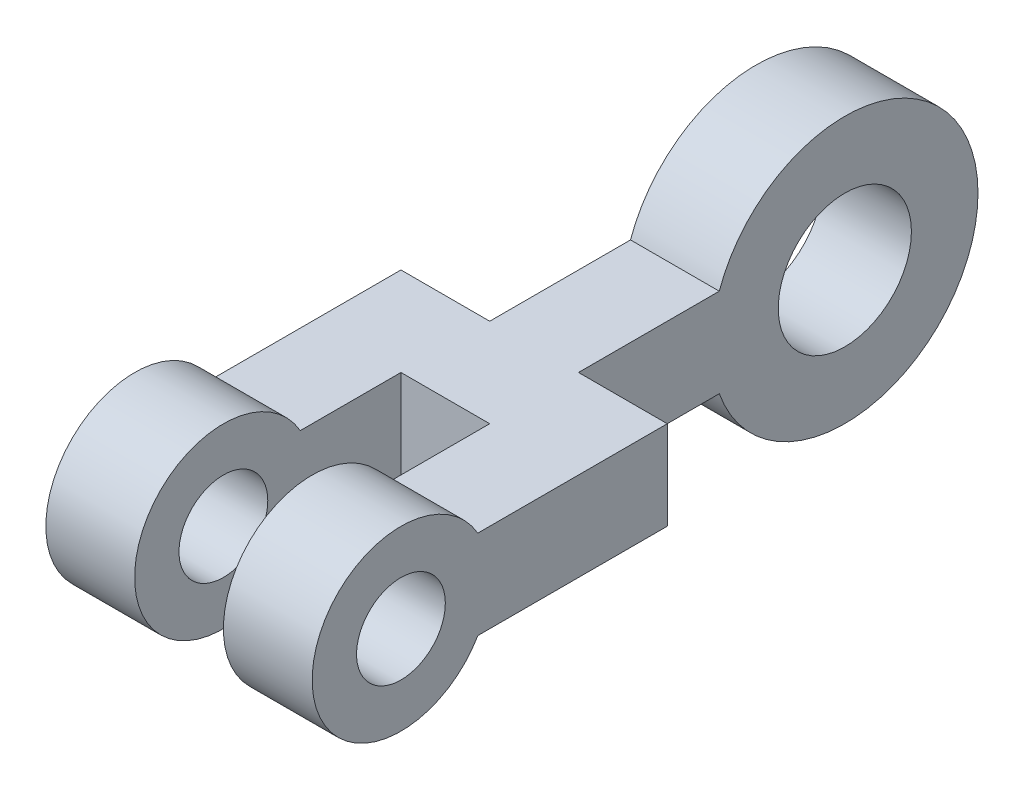
ISO-10303-21;
HEADER;
FILE_DESCRIPTION(('STEP AP214'),'2;1');
FILE_NAME('part.step','',(''),(''),'','','');
FILE_SCHEMA(('AUTOMOTIVE_DESIGN { 1 0 10303 214 1 1 1 1 }'));
ENDSEC;
DATA;
#1=APPLICATION_CONTEXT('core data for automotive mechanical design processes');
#2=APPLICATION_PROTOCOL_DEFINITION('international standard','automotive_design',2000,#1);
#3=PRODUCT_CONTEXT('',#1,'mechanical');
#4=PRODUCT('Part','Part','',(#3));
#5=PRODUCT_RELATED_PRODUCT_CATEGORY('part','',(#4));
#6=PRODUCT_DEFINITION_FORMATION('','',#4);
#7=PRODUCT_DEFINITION_CONTEXT('part definition',#1,'design');
#8=PRODUCT_DEFINITION('design','',#6,#7);
#9=PRODUCT_DEFINITION_SHAPE('','',#8);
#10=(LENGTH_UNIT() NAMED_UNIT(*) SI_UNIT(.MILLI.,.METRE.));
#11=(NAMED_UNIT(*) PLANE_ANGLE_UNIT() SI_UNIT($,.RADIAN.));
#12=(NAMED_UNIT(*) SI_UNIT($,.STERADIAN.) SOLID_ANGLE_UNIT());
#13=UNCERTAINTY_MEASURE_WITH_UNIT(LENGTH_MEASURE(1.E-05),#10,'distance_accuracy_value','');
#14=(GEOMETRIC_REPRESENTATION_CONTEXT(3) GLOBAL_UNCERTAINTY_ASSIGNED_CONTEXT((#13)) GLOBAL_UNIT_ASSIGNED_CONTEXT((#10,
#11,#12)) REPRESENTATION_CONTEXT('',''));
#15=CARTESIAN_POINT('',(0.,0.,0.));
#16=DIRECTION('',(0.,0.,1.));
#17=DIRECTION('',(1.,0.,0.));
#18=AXIS2_PLACEMENT_3D('',#15,#16,#17);
#19=CARTESIAN_POINT('',(0.,6.35,-50.8));
#20=DIRECTION('',(1.,0.,0.));
#21=DIRECTION('',(0.,0.,-1.));
#22=AXIS2_PLACEMENT_3D('',#19,#20,#21);
#23=PLANE('',#22);
#24=CARTESIAN_POINT('',(0.,0.,-12.7));
#25=DIRECTION('',(1.,0.,0.));
#26=DIRECTION('',(0.,0.,-1.));
#27=AXIS2_PLACEMENT_3D('',#24,#25,#26);
#28=CIRCLE('',#27,12.7);
#29=CARTESIAN_POINT('',(0.,6.35,-23.6985226280624));
#30=VERTEX_POINT('',#29);
#31=CARTESIAN_POINT('',(0.,-6.35,-23.6985226280624));
#32=VERTEX_POINT('',#31);
#33=EDGE_CURVE('E253',#30,#32,#28,.T.);
#34=ORIENTED_EDGE('',*,*,#33,.F.);
#35=DIRECTION('',(0.,0.,1.));
#36=VECTOR('',#35,1.);
#37=CARTESIAN_POINT('',(0.,6.35,-50.8));
#38=LINE('',#37,#36);
#39=CARTESIAN_POINT('',(0.,6.35,-50.8));
#40=VERTEX_POINT('',#39);
#41=EDGE_CURVE('E150',#40,#30,#38,.T.);
#42=ORIENTED_EDGE('',*,*,#41,.F.);
#43=DIRECTION('',(0.,-1.,0.));
#44=VECTOR('',#43,1.);
#45=CARTESIAN_POINT('',(0.,6.35,-50.8));
#46=LINE('',#45,#44);
#47=CARTESIAN_POINT('',(0.,-6.35,-50.8));
#48=VERTEX_POINT('',#47);
#49=EDGE_CURVE('E151',#40,#48,#46,.T.);
#50=ORIENTED_EDGE('',*,*,#49,.T.);
#51=DIRECTION('',(0.,0.,1.));
#52=VECTOR('',#51,1.);
#53=CARTESIAN_POINT('',(0.,-6.35,-50.8));
#54=LINE('',#53,#52);
#55=EDGE_CURVE('E183',#48,#32,#54,.T.);
#56=ORIENTED_EDGE('',*,*,#55,.T.);
#57=EDGE_LOOP('',(#34,#42,#50,#56));
#58=FACE_BOUND('',#57,.T.);
#59=CARTESIAN_POINT('',(0.,0.,-12.7));
#60=DIRECTION('',(1.,0.,0.));
#61=DIRECTION('',(0.,0.,-1.));
#62=AXIS2_PLACEMENT_3D('',#59,#60,#61);
#63=CIRCLE('',#62,6.35000000000001);
#64=CARTESIAN_POINT('',(0.,0.,-19.05));
#65=VERTEX_POINT('',#64);
#66=EDGE_CURVE('E248',#65,#65,#63,.T.);
#67=ORIENTED_EDGE('',*,*,#66,.T.);
#68=EDGE_LOOP('',(#67));
#69=FACE_BOUND('',#68,.T.);
#70=ADVANCED_FACE('F34',(#58,#69),#23,.F.);
#71=CARTESIAN_POINT('',(12.7,6.35,-12.7));
#72=DIRECTION('',(-1.,0.,0.));
#73=DIRECTION('',(0.,0.,1.));
#74=AXIS2_PLACEMENT_3D('',#71,#72,#73);
#75=PLANE('',#74);
#76=DIRECTION('',(0.,0.,-1.));
#77=VECTOR('',#76,1.);
#78=CARTESIAN_POINT('',(12.7,6.35,-12.7));
#79=LINE('',#78,#77);
#80=CARTESIAN_POINT('',(12.7,6.35,-23.6985226280624));
#81=VERTEX_POINT('',#80);
#82=CARTESIAN_POINT('',(12.7,6.35,-38.1));
#83=VERTEX_POINT('',#82);
#84=EDGE_CURVE('E222',#81,#83,#79,.T.);
#85=ORIENTED_EDGE('',*,*,#84,.F.);
#86=CARTESIAN_POINT('',(12.7,0.,-12.7));
#87=DIRECTION('',(1.,0.,0.));
#88=DIRECTION('',(0.,0.,-1.));
#89=AXIS2_PLACEMENT_3D('',#86,#87,#88);
#90=CIRCLE('',#89,12.7);
#91=CARTESIAN_POINT('',(12.7,-6.35,-23.6985226280624));
#92=VERTEX_POINT('',#91);
#93=EDGE_CURVE('E254',#81,#92,#90,.T.);
#94=ORIENTED_EDGE('',*,*,#93,.T.);
#95=DIRECTION('',(0.,0.,-1.));
#96=VECTOR('',#95,1.);
#97=CARTESIAN_POINT('',(12.7,-6.35,-12.7));
#98=LINE('',#97,#96);
#99=CARTESIAN_POINT('',(12.7,-6.35,-38.1));
#100=VERTEX_POINT('',#99);
#101=EDGE_CURVE('E177',#92,#100,#98,.T.);
#102=ORIENTED_EDGE('',*,*,#101,.T.);
#103=DIRECTION('',(0.,-1.,0.));
#104=VECTOR('',#103,1.);
#105=CARTESIAN_POINT('',(12.7,6.35,-38.1));
#106=LINE('',#105,#104);
#107=EDGE_CURVE('E41',#83,#100,#106,.T.);
#108=ORIENTED_EDGE('',*,*,#107,.F.);
#109=EDGE_LOOP('',(#85,#94,#102,#108));
#110=FACE_BOUND('',#109,.T.);
#111=CARTESIAN_POINT('',(12.7,0.,-12.7));
#112=DIRECTION('',(1.,0.,0.));
#113=DIRECTION('',(0.,0.,-1.));
#114=AXIS2_PLACEMENT_3D('',#111,#112,#113);
#115=CIRCLE('',#114,6.35000000000001);
#116=CARTESIAN_POINT('',(12.7,0.,-19.05));
#117=VERTEX_POINT('',#116);
#118=EDGE_CURVE('E250',#117,#117,#115,.T.);
#119=ORIENTED_EDGE('',*,*,#118,.F.);
#120=EDGE_LOOP('',(#119));
#121=FACE_BOUND('',#120,.T.);
#122=ADVANCED_FACE('F284',(#110,#121),#75,.F.);
#123=CARTESIAN_POINT('',(12.7,6.35,-38.1));
#124=DIRECTION('',(0.,0.,-1.));
#125=DIRECTION('',(-1.,0.,0.));
#126=AXIS2_PLACEMENT_3D('',#123,#124,#125);
#127=PLANE('',#126);
#128=DIRECTION('',(1.,0.,0.));
#129=VECTOR('',#128,1.);
#130=CARTESIAN_POINT('',(12.7,-6.35,-38.1));
#131=LINE('',#130,#129);
#132=CARTESIAN_POINT('',(25.4,-6.35,-38.1));
#133=VERTEX_POINT('',#132);
#134=EDGE_CURVE('E171',#100,#133,#131,.T.);
#135=ORIENTED_EDGE('',*,*,#134,.T.);
#136=DIRECTION('',(0.,-1.,0.));
#137=VECTOR('',#136,1.);
#138=CARTESIAN_POINT('',(25.4,6.35,-38.1));
#139=LINE('',#138,#137);
#140=CARTESIAN_POINT('',(25.4,6.35,-38.1));
#141=VERTEX_POINT('',#140);
#142=EDGE_CURVE('E162',#141,#133,#139,.T.);
#143=ORIENTED_EDGE('',*,*,#142,.F.);
#144=DIRECTION('',(1.,0.,0.));
#145=VECTOR('',#144,1.);
#146=CARTESIAN_POINT('',(12.7,6.35,-38.1));
#147=LINE('',#146,#145);
#148=EDGE_CURVE('E172',#83,#141,#147,.T.);
#149=ORIENTED_EDGE('',*,*,#148,.F.);
#150=ORIENTED_EDGE('',*,*,#107,.T.);
#151=EDGE_LOOP('',(#135,#143,#149,#150));
#152=FACE_BOUND('',#151,.T.);
#153=ADVANCED_FACE('F169',(#152),#127,.F.);
#154=CARTESIAN_POINT('',(25.4,6.35,-38.1));
#155=DIRECTION('',(1.,0.,0.));
#156=DIRECTION('',(0.,0.,-1.));
#157=AXIS2_PLACEMENT_3D('',#154,#155,#156);
#158=PLANE('',#157);
#159=CARTESIAN_POINT('',(25.4,0.,-12.7));
#160=DIRECTION('',(1.,0.,0.));
#161=DIRECTION('',(0.,0.,-1.));
#162=AXIS2_PLACEMENT_3D('',#159,#160,#161);
#163=CIRCLE('',#162,12.7);
#164=CARTESIAN_POINT('',(25.4,6.35,-23.6985226280624));
#165=VERTEX_POINT('',#164);
#166=CARTESIAN_POINT('',(25.4,-6.35,-23.6985226280624));
#167=VERTEX_POINT('',#166);
#168=EDGE_CURVE('E216',#165,#167,#163,.T.);
#169=ORIENTED_EDGE('',*,*,#168,.F.);
#170=DIRECTION('',(0.,0.,1.));
#171=VECTOR('',#170,1.);
#172=CARTESIAN_POINT('',(25.4,6.35,-38.1));
#173=LINE('',#172,#171);
#174=EDGE_CURVE('E202',#141,#165,#173,.T.);
#175=ORIENTED_EDGE('',*,*,#174,.F.);
#176=ORIENTED_EDGE('',*,*,#142,.T.);
#177=DIRECTION('',(0.,0.,1.));
#178=VECTOR('',#177,1.);
#179=CARTESIAN_POINT('',(25.4,-6.35,-38.1));
#180=LINE('',#179,#178);
#181=EDGE_CURVE('E180',#133,#167,#180,.T.);
#182=ORIENTED_EDGE('',*,*,#181,.T.);
#183=EDGE_LOOP('',(#169,#175,#176,#182));
#184=FACE_BOUND('',#183,.T.);
#185=CARTESIAN_POINT('',(25.4,0.,-12.7));
#186=DIRECTION('',(1.,0.,0.));
#187=DIRECTION('',(0.,0.,-1.));
#188=AXIS2_PLACEMENT_3D('',#185,#186,#187);
#189=CIRCLE('',#188,6.35000000000001);
#190=CARTESIAN_POINT('',(25.4,0.,-19.05));
#191=VERTEX_POINT('',#190);
#192=EDGE_CURVE('E232',#191,#191,#189,.T.);
#193=ORIENTED_EDGE('',*,*,#192,.T.);
#194=EDGE_LOOP('',(#193));
#195=FACE_BOUND('',#194,.T.);
#196=ADVANCED_FACE('F230',(#184,#195),#158,.F.);
#197=CARTESIAN_POINT('',(38.1,6.35,-12.7));
#198=DIRECTION('',(-1.,0.,0.));
#199=DIRECTION('',(0.,0.,1.));
#200=AXIS2_PLACEMENT_3D('',#197,#198,#199);
#201=PLANE('',#200);
#202=DIRECTION('',(0.,0.,-1.));
#203=VECTOR('',#202,1.);
#204=CARTESIAN_POINT('',(38.1,6.35,-12.7));
#205=LINE('',#204,#203);
#206=CARTESIAN_POINT('',(38.1,6.35,-23.6985226280624));
#207=VERTEX_POINT('',#206);
#208=CARTESIAN_POINT('',(38.1,6.35,-50.8));
#209=VERTEX_POINT('',#208);
#210=EDGE_CURVE('E198',#207,#209,#205,.T.);
#211=ORIENTED_EDGE('',*,*,#210,.F.);
#212=CARTESIAN_POINT('',(38.1,0.,-12.7));
#213=DIRECTION('',(1.,0.,0.));
#214=DIRECTION('',(0.,0.,-1.));
#215=AXIS2_PLACEMENT_3D('',#212,#213,#214);
#216=CIRCLE('',#215,12.7);
#217=CARTESIAN_POINT('',(38.1,-6.35,-23.6985226280624));
#218=VERTEX_POINT('',#217);
#219=EDGE_CURVE('E193',#207,#218,#216,.T.);
#220=ORIENTED_EDGE('',*,*,#219,.T.);
#221=DIRECTION('',(0.,0.,-1.));
#222=VECTOR('',#221,1.);
#223=CARTESIAN_POINT('',(38.1,-6.35,-12.7));
#224=LINE('',#223,#222);
#225=CARTESIAN_POINT('',(38.1,-6.35,-50.8));
#226=VERTEX_POINT('',#225);
#227=EDGE_CURVE('E145',#218,#226,#224,.T.);
#228=ORIENTED_EDGE('',*,*,#227,.T.);
#229=DIRECTION('',(0.,-1.,0.));
#230=VECTOR('',#229,1.);
#231=CARTESIAN_POINT('',(38.1,6.35,-50.8));
#232=LINE('',#231,#230);
#233=EDGE_CURVE('E159',#209,#226,#232,.T.);
#234=ORIENTED_EDGE('',*,*,#233,.F.);
#235=EDGE_LOOP('',(#211,#220,#228,#234));
#236=FACE_BOUND('',#235,.T.);
#237=CARTESIAN_POINT('',(38.1,0.,-12.7));
#238=DIRECTION('',(1.,0.,0.));
#239=DIRECTION('',(0.,0.,-1.));
#240=AXIS2_PLACEMENT_3D('',#237,#238,#239);
#241=CIRCLE('',#240,6.35000000000001);
#242=CARTESIAN_POINT('',(38.1,0.,-19.05));
#243=VERTEX_POINT('',#242);
#244=EDGE_CURVE('E237',#243,#243,#241,.T.);
#245=ORIENTED_EDGE('',*,*,#244,.F.);
#246=EDGE_LOOP('',(#245));
#247=FACE_BOUND('',#246,.T.);
#248=ADVANCED_FACE('F189',(#236,#247),#201,.F.);
#249=CARTESIAN_POINT('',(38.1,6.35,-50.8));
#250=DIRECTION('',(0.,0.,1.));
#251=DIRECTION('',(1.,0.,0.));
#252=AXIS2_PLACEMENT_3D('',#249,#250,#251);
#253=PLANE('',#252);
#254=DIRECTION('',(-1.,0.,0.));
#255=VECTOR('',#254,1.);
#256=CARTESIAN_POINT('',(38.1,-6.35,-50.8));
#257=LINE('',#256,#255);
#258=CARTESIAN_POINT('',(25.4,-6.35,-50.8));
#259=VERTEX_POINT('',#258);
#260=EDGE_CURVE('E141',#226,#259,#257,.T.);
#261=ORIENTED_EDGE('',*,*,#260,.T.);
#262=DIRECTION('',(0.,-1.,0.));
#263=VECTOR('',#262,1.);
#264=CARTESIAN_POINT('',(25.4,6.35,-50.8));
#265=LINE('',#264,#263);
#266=CARTESIAN_POINT('',(25.4,6.35,-50.8));
#267=VERTEX_POINT('',#266);
#268=EDGE_CURVE('E140',#267,#259,#265,.T.);
#269=ORIENTED_EDGE('',*,*,#268,.F.);
#270=DIRECTION('',(-1.,0.,0.));
#271=VECTOR('',#270,1.);
#272=CARTESIAN_POINT('',(38.1,6.35,-50.8));
#273=LINE('',#272,#271);
#274=EDGE_CURVE('E197',#209,#267,#273,.T.);
#275=ORIENTED_EDGE('',*,*,#274,.F.);
#276=ORIENTED_EDGE('',*,*,#233,.T.);
#277=EDGE_LOOP('',(#261,#269,#275,#276));
#278=FACE_BOUND('',#277,.T.);
#279=ADVANCED_FACE('F196',(#278),#253,.F.);
#280=CARTESIAN_POINT('',(25.4,6.35,-50.8));
#281=DIRECTION('',(-1.,0.,0.));
#282=DIRECTION('',(0.,0.,1.));
#283=AXIS2_PLACEMENT_3D('',#280,#281,#282);
#284=PLANE('',#283);
#285=DIRECTION('',(0.,0.,-1.));
#286=VECTOR('',#285,1.);
#287=CARTESIAN_POINT('',(25.4,-6.35,-50.8));
#288=LINE('',#287,#286);
#289=CARTESIAN_POINT('',(25.4,-6.35,-70.9394877578617));
#290=VERTEX_POINT('',#289);
#291=EDGE_CURVE('E133',#259,#290,#288,.T.);
#292=ORIENTED_EDGE('',*,*,#291,.T.);
#293=CARTESIAN_POINT('',(25.4,0.,-88.9));
#294=DIRECTION('',(1.,0.,0.));
#295=DIRECTION('',(0.,0.,-1.));
#296=AXIS2_PLACEMENT_3D('',#293,#294,#295);
#297=CIRCLE('',#296,19.05);
#298=CARTESIAN_POINT('',(25.4,6.35,-70.9394877578617));
#299=VERTEX_POINT('',#298);
#300=EDGE_CURVE('E119',#290,#299,#297,.T.);
#301=ORIENTED_EDGE('',*,*,#300,.T.);
#302=DIRECTION('',(0.,0.,-1.));
#303=VECTOR('',#302,1.);
#304=CARTESIAN_POINT('',(25.4,6.35,-50.8));
#305=LINE('',#304,#303);
#306=EDGE_CURVE('E48',#267,#299,#305,.T.);
#307=ORIENTED_EDGE('',*,*,#306,.F.);
#308=ORIENTED_EDGE('',*,*,#268,.T.);
#309=EDGE_LOOP('',(#292,#301,#307,#308));
#310=FACE_BOUND('',#309,.T.);
#311=CARTESIAN_POINT('',(25.4,0.,-88.9));
#312=DIRECTION('',(1.,0.,0.));
#313=DIRECTION('',(0.,0.,-1.));
#314=AXIS2_PLACEMENT_3D('',#311,#312,#313);
#315=CIRCLE('',#314,9.52500000000001);
#316=CARTESIAN_POINT('',(25.4,0.,-98.425));
#317=VERTEX_POINT('',#316);
#318=EDGE_CURVE('E126',#317,#317,#315,.T.);
#319=ORIENTED_EDGE('',*,*,#318,.F.);
#320=EDGE_LOOP('',(#319));
#321=FACE_BOUND('',#320,.T.);
#322=ADVANCED_FACE('F137',(#310,#321),#284,.F.);
#323=CARTESIAN_POINT('',(12.7,6.35,-88.9));
#324=DIRECTION('',(1.,0.,0.));
#325=DIRECTION('',(0.,0.,-1.));
#326=AXIS2_PLACEMENT_3D('',#323,#324,#325);
#327=PLANE('',#326);
#328=DIRECTION('',(0.,0.,1.));
#329=VECTOR('',#328,1.);
#330=CARTESIAN_POINT('',(12.7,6.35,-88.9));
#331=LINE('',#330,#329);
#332=CARTESIAN_POINT('',(12.7,6.35,-70.9394877578617));
#333=VERTEX_POINT('',#332);
#334=CARTESIAN_POINT('',(12.7,6.35,-50.8));
#335=VERTEX_POINT('',#334);
#336=EDGE_CURVE('E200',#333,#335,#331,.T.);
#337=ORIENTED_EDGE('',*,*,#336,.F.);
#338=CARTESIAN_POINT('',(12.7,0.,-88.9));
#339=DIRECTION('',(1.,0.,0.));
#340=DIRECTION('',(0.,0.,-1.));
#341=AXIS2_PLACEMENT_3D('',#338,#339,#340);
#342=CIRCLE('',#341,19.05);
#343=CARTESIAN_POINT('',(12.7,-6.35,-70.9394877578617));
#344=VERTEX_POINT('',#343);
#345=EDGE_CURVE('E259',#344,#333,#342,.T.);
#346=ORIENTED_EDGE('',*,*,#345,.F.);
#347=DIRECTION('',(0.,0.,1.));
#348=VECTOR('',#347,1.);
#349=CARTESIAN_POINT('',(12.7,-6.35,-88.9));
#350=LINE('',#349,#348);
#351=CARTESIAN_POINT('',(12.7,-6.35,-50.8));
#352=VERTEX_POINT('',#351);
#353=EDGE_CURVE('E135',#344,#352,#350,.T.);
#354=ORIENTED_EDGE('',*,*,#353,.T.);
#355=DIRECTION('',(0.,-1.,0.));
#356=VECTOR('',#355,1.);
#357=CARTESIAN_POINT('',(12.7,6.35,-50.8));
#358=LINE('',#357,#356);
#359=EDGE_CURVE('E154',#335,#352,#358,.T.);
#360=ORIENTED_EDGE('',*,*,#359,.F.);
#361=EDGE_LOOP('',(#337,#346,#354,#360));
#362=FACE_BOUND('',#361,.T.);
#363=CARTESIAN_POINT('',(12.7,0.,-88.9));
#364=DIRECTION('',(1.,0.,0.));
#365=DIRECTION('',(0.,0.,-1.));
#366=AXIS2_PLACEMENT_3D('',#363,#364,#365);
#367=CIRCLE('',#366,9.52500000000001);
#368=CARTESIAN_POINT('',(12.7,0.,-98.425));
#369=VERTEX_POINT('',#368);
#370=EDGE_CURVE('E125',#369,#369,#367,.T.);
#371=ORIENTED_EDGE('',*,*,#370,.T.);
#372=EDGE_LOOP('',(#371));
#373=FACE_BOUND('',#372,.T.);
#374=ADVANCED_FACE('F267',(#362,#373),#327,.F.);
#375=CARTESIAN_POINT('',(12.7,6.35,-50.8));
#376=DIRECTION('',(0.,0.,1.));
#377=DIRECTION('',(1.,0.,0.));
#378=AXIS2_PLACEMENT_3D('',#375,#376,#377);
#379=PLANE('',#378);
#380=DIRECTION('',(-1.,0.,0.));
#381=VECTOR('',#380,1.);
#382=CARTESIAN_POINT('',(12.7,-6.35,-50.8));
#383=LINE('',#382,#381);
#384=EDGE_CURVE('E143',#352,#48,#383,.T.);
#385=ORIENTED_EDGE('',*,*,#384,.T.);
#386=ORIENTED_EDGE('',*,*,#49,.F.);
#387=DIRECTION('',(-1.,0.,0.));
#388=VECTOR('',#387,1.);
#389=CARTESIAN_POINT('',(12.7,6.35,-50.8));
#390=LINE('',#389,#388);
#391=EDGE_CURVE('E155',#335,#40,#390,.T.);
#392=ORIENTED_EDGE('',*,*,#391,.F.);
#393=ORIENTED_EDGE('',*,*,#359,.T.);
#394=EDGE_LOOP('',(#385,#386,#392,#393));
#395=FACE_BOUND('',#394,.T.);
#396=ADVANCED_FACE('F304',(#395),#379,.F.);
#397=CARTESIAN_POINT('',(0.,6.35,0.));
#398=DIRECTION('',(0.,1.,0.));
#399=DIRECTION('',(0.,0.,1.));
#400=AXIS2_PLACEMENT_3D('',#397,#398,#399);
#401=PLANE('',#400);
#402=DIRECTION('',(1.,0.,0.));
#403=VECTOR('',#402,1.);
#404=CARTESIAN_POINT('',(12.7,6.35,-70.9394877578617));
#405=LINE('',#404,#403);
#406=EDGE_CURVE('E52',#333,#299,#405,.T.);
#407=ORIENTED_EDGE('',*,*,#406,.F.);
#408=ORIENTED_EDGE('',*,*,#336,.T.);
#409=ORIENTED_EDGE('',*,*,#391,.T.);
#410=ORIENTED_EDGE('',*,*,#41,.T.);
#411=DIRECTION('',(1.,0.,0.));
#412=VECTOR('',#411,1.);
#413=CARTESIAN_POINT('',(0.,6.35,-23.6985226280624));
#414=LINE('',#413,#412);
#415=EDGE_CURVE('E239',#30,#81,#414,.T.);
#416=ORIENTED_EDGE('',*,*,#415,.T.);
#417=ORIENTED_EDGE('',*,*,#84,.T.);
#418=ORIENTED_EDGE('',*,*,#148,.T.);
#419=ORIENTED_EDGE('',*,*,#174,.T.);
#420=DIRECTION('',(1.,0.,0.));
#421=VECTOR('',#420,1.);
#422=CARTESIAN_POINT('',(25.4,6.35,-23.6985226280624));
#423=LINE('',#422,#421);
#424=EDGE_CURVE('E208',#165,#207,#423,.T.);
#425=ORIENTED_EDGE('',*,*,#424,.T.);
#426=ORIENTED_EDGE('',*,*,#210,.T.);
#427=ORIENTED_EDGE('',*,*,#274,.T.);
#428=ORIENTED_EDGE('',*,*,#306,.T.);
#429=EDGE_LOOP('',(#407,#408,#409,#410,#416,#417,#418,#419,#425,#426,#427,#428));
#430=FACE_BOUND('',#429,.T.);
#431=ADVANCED_FACE('F225',(#430),#401,.T.);
#432=CARTESIAN_POINT('',(0.,-6.35,0.));
#433=DIRECTION('',(0.,1.,0.));
#434=DIRECTION('',(0.,0.,1.));
#435=AXIS2_PLACEMENT_3D('',#432,#433,#434);
#436=PLANE('',#435);
#437=ORIENTED_EDGE('',*,*,#353,.F.);
#438=DIRECTION('',(1.,0.,0.));
#439=VECTOR('',#438,1.);
#440=CARTESIAN_POINT('',(12.7,-6.35,-70.9394877578617));
#441=LINE('',#440,#439);
#442=EDGE_CURVE('E11',#344,#290,#441,.T.);
#443=ORIENTED_EDGE('',*,*,#442,.T.);
#444=ORIENTED_EDGE('',*,*,#291,.F.);
#445=ORIENTED_EDGE('',*,*,#260,.F.);
#446=ORIENTED_EDGE('',*,*,#227,.F.);
#447=DIRECTION('',(1.,0.,0.));
#448=VECTOR('',#447,1.);
#449=CARTESIAN_POINT('',(25.4,-6.35,-23.6985226280624));
#450=LINE('',#449,#448);
#451=EDGE_CURVE('E213',#167,#218,#450,.T.);
#452=ORIENTED_EDGE('',*,*,#451,.F.);
#453=ORIENTED_EDGE('',*,*,#181,.F.);
#454=ORIENTED_EDGE('',*,*,#134,.F.);
#455=ORIENTED_EDGE('',*,*,#101,.F.);
#456=DIRECTION('',(1.,0.,0.));
#457=VECTOR('',#456,1.);
#458=CARTESIAN_POINT('',(0.,-6.35,-23.6985226280624));
#459=LINE('',#458,#457);
#460=EDGE_CURVE('E243',#32,#92,#459,.T.);
#461=ORIENTED_EDGE('',*,*,#460,.F.);
#462=ORIENTED_EDGE('',*,*,#55,.F.);
#463=ORIENTED_EDGE('',*,*,#384,.F.);
#464=EDGE_LOOP('',(#437,#443,#444,#445,#446,#452,#453,#454,#455,#461,#462,#463));
#465=FACE_BOUND('',#464,.T.);
#466=ADVANCED_FACE('F131',(#465),#436,.F.);
#467=CARTESIAN_POINT('',(25.4,0.,-12.7));
#468=DIRECTION('',(1.,0.,0.));
#469=DIRECTION('',(0.,0.,-1.));
#470=AXIS2_PLACEMENT_3D('',#467,#468,#469);
#471=CYLINDRICAL_SURFACE('',#470,6.35000000000001);
#472=ORIENTED_EDGE('',*,*,#244,.T.);
#473=EDGE_LOOP('',(#472));
#474=FACE_BOUND('',#473,.T.);
#475=ORIENTED_EDGE('',*,*,#192,.F.);
#476=EDGE_LOOP('',(#475));
#477=FACE_BOUND('',#476,.T.);
#478=ADVANCED_FACE('F297',(#474,#477),#471,.F.);
#479=CARTESIAN_POINT('',(25.4,0.,-12.7));
#480=DIRECTION('',(1.,0.,0.));
#481=DIRECTION('',(0.,0.,-1.));
#482=AXIS2_PLACEMENT_3D('',#479,#480,#481);
#483=CYLINDRICAL_SURFACE('',#482,12.7);
#484=ORIENTED_EDGE('',*,*,#219,.F.);
#485=ORIENTED_EDGE('',*,*,#424,.F.);
#486=ORIENTED_EDGE('',*,*,#168,.T.);
#487=ORIENTED_EDGE('',*,*,#451,.T.);
#488=EDGE_LOOP('',(#484,#485,#486,#487));
#489=FACE_BOUND('',#488,.T.);
#490=ADVANCED_FACE('F229',(#489),#483,.T.);
#491=CARTESIAN_POINT('',(0.,0.,-12.7));
#492=DIRECTION('',(1.,0.,0.));
#493=DIRECTION('',(0.,0.,-1.));
#494=AXIS2_PLACEMENT_3D('',#491,#492,#493);
#495=CYLINDRICAL_SURFACE('',#494,6.35000000000001);
#496=ORIENTED_EDGE('',*,*,#118,.T.);
#497=EDGE_LOOP('',(#496));
#498=FACE_BOUND('',#497,.T.);
#499=ORIENTED_EDGE('',*,*,#66,.F.);
#500=EDGE_LOOP('',(#499));
#501=FACE_BOUND('',#500,.T.);
#502=ADVANCED_FACE('F279',(#498,#501),#495,.F.);
#503=CARTESIAN_POINT('',(0.,0.,-12.7));
#504=DIRECTION('',(1.,0.,0.));
#505=DIRECTION('',(0.,0.,-1.));
#506=AXIS2_PLACEMENT_3D('',#503,#504,#505);
#507=CYLINDRICAL_SURFACE('',#506,12.7);
#508=ORIENTED_EDGE('',*,*,#93,.F.);
#509=ORIENTED_EDGE('',*,*,#415,.F.);
#510=ORIENTED_EDGE('',*,*,#33,.T.);
#511=ORIENTED_EDGE('',*,*,#460,.T.);
#512=EDGE_LOOP('',(#508,#509,#510,#511));
#513=FACE_BOUND('',#512,.T.);
#514=ADVANCED_FACE('F271',(#513),#507,.T.);
#515=CARTESIAN_POINT('',(12.7,0.,-88.9));
#516=DIRECTION('',(1.,0.,0.));
#517=DIRECTION('',(0.,0.,-1.));
#518=AXIS2_PLACEMENT_3D('',#515,#516,#517);
#519=CYLINDRICAL_SURFACE('',#518,9.52500000000001);
#520=ORIENTED_EDGE('',*,*,#318,.T.);
#521=EDGE_LOOP('',(#520));
#522=FACE_BOUND('',#521,.T.);
#523=ORIENTED_EDGE('',*,*,#370,.F.);
#524=EDGE_LOOP('',(#523));
#525=FACE_BOUND('',#524,.T.);
#526=ADVANCED_FACE('F269',(#522,#525),#519,.F.);
#527=CARTESIAN_POINT('',(12.7,0.,-88.9));
#528=DIRECTION('',(1.,0.,0.));
#529=DIRECTION('',(0.,0.,-1.));
#530=AXIS2_PLACEMENT_3D('',#527,#528,#529);
#531=CYLINDRICAL_SURFACE('',#530,19.05);
#532=ORIENTED_EDGE('',*,*,#345,.T.);
#533=ORIENTED_EDGE('',*,*,#406,.T.);
#534=ORIENTED_EDGE('',*,*,#300,.F.);
#535=ORIENTED_EDGE('',*,*,#442,.F.);
#536=EDGE_LOOP('',(#532,#533,#534,#535));
#537=FACE_BOUND('',#536,.T.);
#538=ADVANCED_FACE('F121',(#537),#531,.T.);
#539=CLOSED_SHELL('',(#70,#122,#153,#196,#248,#279,#322,#374,#396,#431,#466,#478,#490,#502,#514,
#526,#538));
#540=MANIFOLD_SOLID_BREP('B2',#539);
#541=ADVANCED_BREP_SHAPE_REPRESENTATION('',(#18,#540),#14);
#542=SHAPE_DEFINITION_REPRESENTATION(#9,#541);
ENDSEC;
END-ISO-10303-21;
